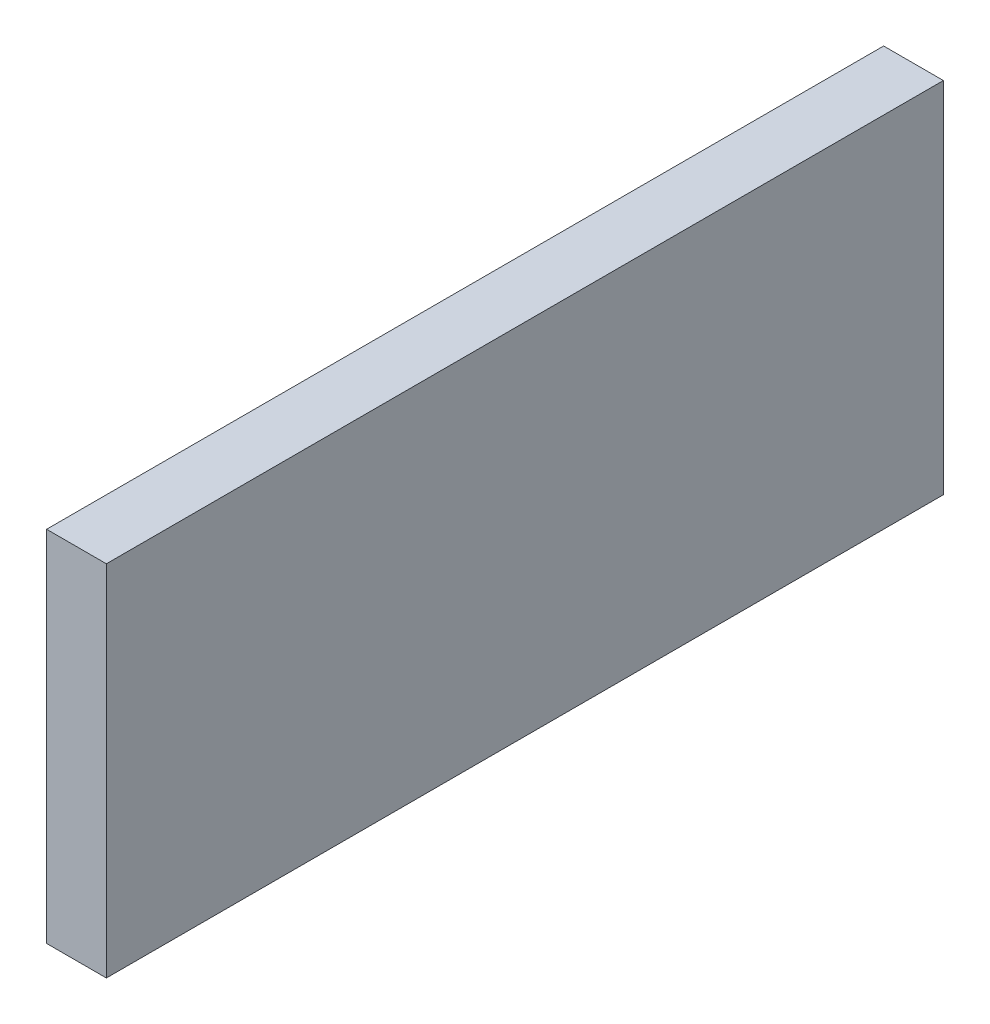
ISO-10303-21;
HEADER;
FILE_DESCRIPTION(('STEP AP214'),'2;1');
FILE_NAME('part.step','',(''),(''),'','','');
FILE_SCHEMA(('AUTOMOTIVE_DESIGN { 1 0 10303 214 1 1 1 1 }'));
ENDSEC;
DATA;
#1=APPLICATION_CONTEXT('core data for automotive mechanical design processes');
#2=APPLICATION_PROTOCOL_DEFINITION('international standard','automotive_design',2000,#1);
#3=PRODUCT_CONTEXT('',#1,'mechanical');
#4=PRODUCT('Part','Part','',(#3));
#5=PRODUCT_RELATED_PRODUCT_CATEGORY('part','',(#4));
#6=PRODUCT_DEFINITION_FORMATION('','',#4);
#7=PRODUCT_DEFINITION_CONTEXT('part definition',#1,'design');
#8=PRODUCT_DEFINITION('design','',#6,#7);
#9=PRODUCT_DEFINITION_SHAPE('','',#8);
#10=(LENGTH_UNIT() NAMED_UNIT(*) SI_UNIT(.MILLI.,.METRE.));
#11=(NAMED_UNIT(*) PLANE_ANGLE_UNIT() SI_UNIT($,.RADIAN.));
#12=(NAMED_UNIT(*) SI_UNIT($,.STERADIAN.) SOLID_ANGLE_UNIT());
#13=UNCERTAINTY_MEASURE_WITH_UNIT(LENGTH_MEASURE(1.E-05),#10,'distance_accuracy_value','');
#14=(GEOMETRIC_REPRESENTATION_CONTEXT(3) GLOBAL_UNCERTAINTY_ASSIGNED_CONTEXT((#13)) GLOBAL_UNIT_ASSIGNED_CONTEXT((#10,
#11,#12)) REPRESENTATION_CONTEXT('',''));
#15=CARTESIAN_POINT('',(0.,0.,0.));
#16=DIRECTION('',(0.,0.,1.));
#17=DIRECTION('',(1.,0.,0.));
#18=AXIS2_PLACEMENT_3D('',#15,#16,#17);
#19=CARTESIAN_POINT('',(2.5,22.8405467821038,10.7643065581182));
#20=DIRECTION('',(0.,0.,-1.));
#21=DIRECTION('',(-1.,0.,0.));
#22=AXIS2_PLACEMENT_3D('',#19,#20,#21);
#23=PLANE('',#22);
#24=DIRECTION('',(0.,-1.,0.));
#25=VECTOR('',#24,1.);
#26=CARTESIAN_POINT('',(0.,22.8405467821038,10.7643065581182));
#27=LINE('',#26,#25);
#28=CARTESIAN_POINT('',(0.,22.8405467821038,10.7643065581182));
#29=VERTEX_POINT('',#28);
#30=CARTESIAN_POINT('',(0.,7.84054678210379,10.7643065581182));
#31=VERTEX_POINT('',#30);
#32=EDGE_CURVE('E106',#29,#31,#27,.T.);
#33=ORIENTED_EDGE('',*,*,#32,.T.);
#34=DIRECTION('',(-1.,0.,0.));
#35=VECTOR('',#34,1.);
#36=CARTESIAN_POINT('',(2.5,7.84054678210379,10.7643065581182));
#37=LINE('',#36,#35);
#38=CARTESIAN_POINT('',(2.5,7.84054678210379,10.7643065581182));
#39=VERTEX_POINT('',#38);
#40=EDGE_CURVE('E11',#39,#31,#37,.T.);
#41=ORIENTED_EDGE('',*,*,#40,.F.);
#42=DIRECTION('',(0.,-1.,0.));
#43=VECTOR('',#42,1.);
#44=CARTESIAN_POINT('',(2.5,22.8405467821038,10.7643065581182));
#45=LINE('',#44,#43);
#46=CARTESIAN_POINT('',(2.5,22.8405467821038,10.7643065581182));
#47=VERTEX_POINT('',#46);
#48=EDGE_CURVE('E94',#47,#39,#45,.T.);
#49=ORIENTED_EDGE('',*,*,#48,.F.);
#50=DIRECTION('',(-1.,0.,0.));
#51=VECTOR('',#50,1.);
#52=CARTESIAN_POINT('',(2.5,22.8405467821038,10.7643065581182));
#53=LINE('',#52,#51);
#54=EDGE_CURVE('E102',#47,#29,#53,.T.);
#55=ORIENTED_EDGE('',*,*,#54,.T.);
#56=EDGE_LOOP('',(#33,#41,#49,#55));
#57=FACE_BOUND('',#56,.T.);
#58=ADVANCED_FACE('F43',(#57),#23,.F.);
#59=CARTESIAN_POINT('',(2.5,7.84054678210379,10.7643065581182));
#60=DIRECTION('',(0.,1.,0.));
#61=DIRECTION('',(0.,0.,1.));
#62=AXIS2_PLACEMENT_3D('',#59,#60,#61);
#63=PLANE('',#62);
#64=DIRECTION('',(0.,0.,-1.));
#65=VECTOR('',#64,1.);
#66=CARTESIAN_POINT('',(0.,7.84054678210379,10.7643065581182));
#67=LINE('',#66,#65);
#68=CARTESIAN_POINT('',(0.,7.84054678210379,-24.2356934418818));
#69=VERTEX_POINT('',#68);
#70=EDGE_CURVE('E98',#31,#69,#67,.T.);
#71=ORIENTED_EDGE('',*,*,#70,.T.);
#72=DIRECTION('',(-1.,0.,0.));
#73=VECTOR('',#72,1.);
#74=CARTESIAN_POINT('',(2.5,7.84054678210379,-24.2356934418818));
#75=LINE('',#74,#73);
#76=CARTESIAN_POINT('',(2.5,7.84054678210379,-24.2356934418818));
#77=VERTEX_POINT('',#76);
#78=EDGE_CURVE('E51',#77,#69,#75,.T.);
#79=ORIENTED_EDGE('',*,*,#78,.F.);
#80=DIRECTION('',(0.,0.,-1.));
#81=VECTOR('',#80,1.);
#82=CARTESIAN_POINT('',(2.5,7.84054678210379,10.7643065581182));
#83=LINE('',#82,#81);
#84=EDGE_CURVE('E89',#39,#77,#83,.T.);
#85=ORIENTED_EDGE('',*,*,#84,.F.);
#86=ORIENTED_EDGE('',*,*,#40,.T.);
#87=EDGE_LOOP('',(#71,#79,#85,#86));
#88=FACE_BOUND('',#87,.T.);
#89=ADVANCED_FACE('F97',(#88),#63,.F.);
#90=CARTESIAN_POINT('',(2.5,22.8405467821038,-24.2356934418818));
#91=DIRECTION('',(0.,0.,1.));
#92=DIRECTION('',(1.,0.,0.));
#93=AXIS2_PLACEMENT_3D('',#90,#91,#92);
#94=PLANE('',#93);
#95=DIRECTION('',(0.,1.,0.));
#96=VECTOR('',#95,1.);
#97=CARTESIAN_POINT('',(0.,22.8405467821038,-24.2356934418818));
#98=LINE('',#97,#96);
#99=CARTESIAN_POINT('',(0.,22.8405467821038,-24.2356934418818));
#100=VERTEX_POINT('',#99);
#101=EDGE_CURVE('E76',#69,#100,#98,.T.);
#102=ORIENTED_EDGE('',*,*,#101,.T.);
#103=DIRECTION('',(-1.,0.,0.));
#104=VECTOR('',#103,1.);
#105=CARTESIAN_POINT('',(2.5,22.8405467821038,-24.2356934418818));
#106=LINE('',#105,#104);
#107=CARTESIAN_POINT('',(2.5,22.8405467821038,-24.2356934418818));
#108=VERTEX_POINT('',#107);
#109=EDGE_CURVE('E99',#108,#100,#106,.T.);
#110=ORIENTED_EDGE('',*,*,#109,.F.);
#111=DIRECTION('',(0.,1.,0.));
#112=VECTOR('',#111,1.);
#113=CARTESIAN_POINT('',(2.5,22.8405467821038,-24.2356934418818));
#114=LINE('',#113,#112);
#115=EDGE_CURVE('E92',#77,#108,#114,.T.);
#116=ORIENTED_EDGE('',*,*,#115,.F.);
#117=ORIENTED_EDGE('',*,*,#78,.T.);
#118=EDGE_LOOP('',(#102,#110,#116,#117));
#119=FACE_BOUND('',#118,.T.);
#120=ADVANCED_FACE('F100',(#119),#94,.F.);
#121=CARTESIAN_POINT('',(2.5,22.8405467821038,10.7643065581182));
#122=DIRECTION('',(0.,-1.,0.));
#123=DIRECTION('',(0.,0.,-1.));
#124=AXIS2_PLACEMENT_3D('',#121,#122,#123);
#125=PLANE('',#124);
#126=DIRECTION('',(0.,0.,1.));
#127=VECTOR('',#126,1.);
#128=CARTESIAN_POINT('',(0.,22.8405467821038,10.7643065581182));
#129=LINE('',#128,#127);
#130=EDGE_CURVE('E82',#100,#29,#129,.T.);
#131=ORIENTED_EDGE('',*,*,#130,.T.);
#132=ORIENTED_EDGE('',*,*,#54,.F.);
#133=DIRECTION('',(0.,0.,1.));
#134=VECTOR('',#133,1.);
#135=CARTESIAN_POINT('',(2.5,22.8405467821038,10.7643065581182));
#136=LINE('',#135,#134);
#137=EDGE_CURVE('E59',#108,#47,#136,.T.);
#138=ORIENTED_EDGE('',*,*,#137,.F.);
#139=ORIENTED_EDGE('',*,*,#109,.T.);
#140=EDGE_LOOP('',(#131,#132,#138,#139));
#141=FACE_BOUND('',#140,.T.);
#142=ADVANCED_FACE('F113',(#141),#125,.F.);
#143=CARTESIAN_POINT('',(2.5,0.,0.));
#144=DIRECTION('',(1.,0.,0.));
#145=DIRECTION('',(0.,0.,-1.));
#146=AXIS2_PLACEMENT_3D('',#143,#144,#145);
#147=PLANE('',#146);
#148=ORIENTED_EDGE('',*,*,#48,.T.);
#149=ORIENTED_EDGE('',*,*,#84,.T.);
#150=ORIENTED_EDGE('',*,*,#115,.T.);
#151=ORIENTED_EDGE('',*,*,#137,.T.);
#152=EDGE_LOOP('',(#148,#149,#150,#151));
#153=FACE_BOUND('',#152,.T.);
#154=ADVANCED_FACE('F90',(#153),#147,.T.);
#155=CARTESIAN_POINT('',(0.,0.,0.));
#156=DIRECTION('',(1.,0.,0.));
#157=DIRECTION('',(0.,0.,-1.));
#158=AXIS2_PLACEMENT_3D('',#155,#156,#157);
#159=PLANE('',#158);
#160=ORIENTED_EDGE('',*,*,#32,.F.);
#161=ORIENTED_EDGE('',*,*,#130,.F.);
#162=ORIENTED_EDGE('',*,*,#101,.F.);
#163=ORIENTED_EDGE('',*,*,#70,.F.);
#164=EDGE_LOOP('',(#160,#161,#162,#163));
#165=FACE_BOUND('',#164,.T.);
#166=ADVANCED_FACE('F116',(#165),#159,.F.);
#167=CLOSED_SHELL('',(#58,#89,#120,#142,#154,#166));
#168=MANIFOLD_SOLID_BREP('B2',#167);
#169=ADVANCED_BREP_SHAPE_REPRESENTATION('',(#18,#168),#14);
#170=SHAPE_DEFINITION_REPRESENTATION(#9,#169);
ENDSEC;
END-ISO-10303-21;
